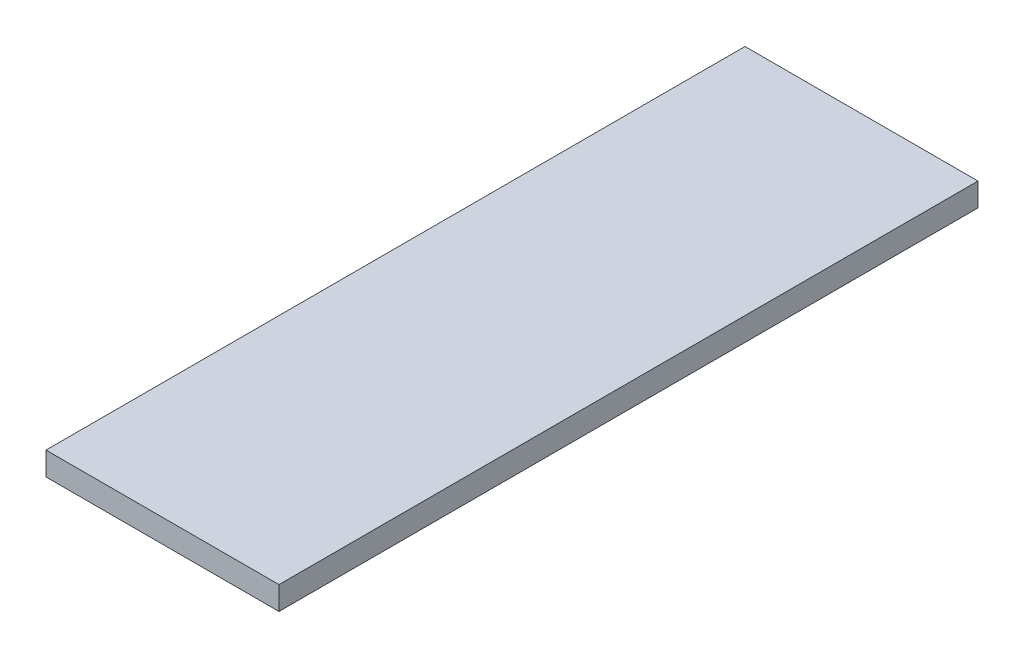
ISO-10303-21;
HEADER;
FILE_DESCRIPTION(('STEP AP214'),'2;1');
FILE_NAME('part.step','',(''),(''),'','','');
FILE_SCHEMA(('AUTOMOTIVE_DESIGN { 1 0 10303 214 1 1 1 1 }'));
ENDSEC;
DATA;
#1=APPLICATION_CONTEXT('core data for automotive mechanical design processes');
#2=APPLICATION_PROTOCOL_DEFINITION('international standard','automotive_design',2000,#1);
#3=PRODUCT_CONTEXT('',#1,'mechanical');
#4=PRODUCT('Part','Part','',(#3));
#5=PRODUCT_RELATED_PRODUCT_CATEGORY('part','',(#4));
#6=PRODUCT_DEFINITION_FORMATION('','',#4);
#7=PRODUCT_DEFINITION_CONTEXT('part definition',#1,'design');
#8=PRODUCT_DEFINITION('design','',#6,#7);
#9=PRODUCT_DEFINITION_SHAPE('','',#8);
#10=(LENGTH_UNIT() NAMED_UNIT(*) SI_UNIT(.MILLI.,.METRE.));
#11=(NAMED_UNIT(*) PLANE_ANGLE_UNIT() SI_UNIT($,.RADIAN.));
#12=(NAMED_UNIT(*) SI_UNIT($,.STERADIAN.) SOLID_ANGLE_UNIT());
#13=UNCERTAINTY_MEASURE_WITH_UNIT(LENGTH_MEASURE(1.E-05),#10,'distance_accuracy_value','');
#14=(GEOMETRIC_REPRESENTATION_CONTEXT(3) GLOBAL_UNCERTAINTY_ASSIGNED_CONTEXT((#13)) GLOBAL_UNIT_ASSIGNED_CONTEXT((#10,
#11,#12)) REPRESENTATION_CONTEXT('',''));
#15=CARTESIAN_POINT('',(0.,0.,0.));
#16=DIRECTION('',(0.,0.,1.));
#17=DIRECTION('',(1.,0.,0.));
#18=AXIS2_PLACEMENT_3D('',#15,#16,#17);
#19=CARTESIAN_POINT('',(0.,10.,0.));
#20=DIRECTION('',(1.,0.,0.));
#21=DIRECTION('',(0.,0.,-1.));
#22=AXIS2_PLACEMENT_3D('',#19,#20,#21);
#23=PLANE('',#22);
#24=DIRECTION('',(0.,0.,1.));
#25=VECTOR('',#24,1.);
#26=CARTESIAN_POINT('',(0.,0.,0.));
#27=LINE('',#26,#25);
#28=CARTESIAN_POINT('',(0.,0.,-300.));
#29=VERTEX_POINT('',#28);
#30=CARTESIAN_POINT('',(0.,0.,0.));
#31=VERTEX_POINT('',#30);
#32=EDGE_CURVE('E98',#29,#31,#27,.T.);
#33=ORIENTED_EDGE('',*,*,#32,.T.);
#34=DIRECTION('',(0.,-1.,0.));
#35=VECTOR('',#34,1.);
#36=CARTESIAN_POINT('',(0.,10.,0.));
#37=LINE('',#36,#35);
#38=CARTESIAN_POINT('',(0.,10.,0.));
#39=VERTEX_POINT('',#38);
#40=EDGE_CURVE('E11',#39,#31,#37,.T.);
#41=ORIENTED_EDGE('',*,*,#40,.F.);
#42=DIRECTION('',(0.,0.,1.));
#43=VECTOR('',#42,1.);
#44=CARTESIAN_POINT('',(0.,10.,0.));
#45=LINE('',#44,#43);
#46=CARTESIAN_POINT('',(0.,10.,-300.));
#47=VERTEX_POINT('',#46);
#48=EDGE_CURVE('E86',#47,#39,#45,.T.);
#49=ORIENTED_EDGE('',*,*,#48,.F.);
#50=DIRECTION('',(0.,-1.,0.));
#51=VECTOR('',#50,1.);
#52=CARTESIAN_POINT('',(0.,10.,-300.));
#53=LINE('',#52,#51);
#54=EDGE_CURVE('E94',#47,#29,#53,.T.);
#55=ORIENTED_EDGE('',*,*,#54,.T.);
#56=EDGE_LOOP('',(#33,#41,#49,#55));
#57=FACE_BOUND('',#56,.T.);
#58=ADVANCED_FACE('F35',(#57),#23,.F.);
#59=CARTESIAN_POINT('',(0.,10.,0.));
#60=DIRECTION('',(0.,0.,-1.));
#61=DIRECTION('',(-1.,0.,0.));
#62=AXIS2_PLACEMENT_3D('',#59,#60,#61);
#63=PLANE('',#62);
#64=DIRECTION('',(1.,0.,0.));
#65=VECTOR('',#64,1.);
#66=CARTESIAN_POINT('',(0.,0.,0.));
#67=LINE('',#66,#65);
#68=CARTESIAN_POINT('',(100.,0.,0.));
#69=VERTEX_POINT('',#68);
#70=EDGE_CURVE('E90',#31,#69,#67,.T.);
#71=ORIENTED_EDGE('',*,*,#70,.T.);
#72=DIRECTION('',(0.,-1.,0.));
#73=VECTOR('',#72,1.);
#74=CARTESIAN_POINT('',(100.,10.,0.));
#75=LINE('',#74,#73);
#76=CARTESIAN_POINT('',(100.,10.,0.));
#77=VERTEX_POINT('',#76);
#78=EDGE_CURVE('E43',#77,#69,#75,.T.);
#79=ORIENTED_EDGE('',*,*,#78,.F.);
#80=DIRECTION('',(1.,0.,0.));
#81=VECTOR('',#80,1.);
#82=CARTESIAN_POINT('',(0.,10.,0.));
#83=LINE('',#82,#81);
#84=EDGE_CURVE('E81',#39,#77,#83,.T.);
#85=ORIENTED_EDGE('',*,*,#84,.F.);
#86=ORIENTED_EDGE('',*,*,#40,.T.);
#87=EDGE_LOOP('',(#71,#79,#85,#86));
#88=FACE_BOUND('',#87,.T.);
#89=ADVANCED_FACE('F89',(#88),#63,.F.);
#90=CARTESIAN_POINT('',(100.,10.,0.));
#91=DIRECTION('',(-1.,0.,0.));
#92=DIRECTION('',(0.,0.,1.));
#93=AXIS2_PLACEMENT_3D('',#90,#91,#92);
#94=PLANE('',#93);
#95=DIRECTION('',(0.,0.,-1.));
#96=VECTOR('',#95,1.);
#97=CARTESIAN_POINT('',(100.,0.,0.));
#98=LINE('',#97,#96);
#99=CARTESIAN_POINT('',(100.,0.,-300.));
#100=VERTEX_POINT('',#99);
#101=EDGE_CURVE('E68',#69,#100,#98,.T.);
#102=ORIENTED_EDGE('',*,*,#101,.T.);
#103=DIRECTION('',(0.,-1.,0.));
#104=VECTOR('',#103,1.);
#105=CARTESIAN_POINT('',(100.,10.,-300.));
#106=LINE('',#105,#104);
#107=CARTESIAN_POINT('',(100.,10.,-300.));
#108=VERTEX_POINT('',#107);
#109=EDGE_CURVE('E91',#108,#100,#106,.T.);
#110=ORIENTED_EDGE('',*,*,#109,.F.);
#111=DIRECTION('',(0.,0.,-1.));
#112=VECTOR('',#111,1.);
#113=CARTESIAN_POINT('',(100.,10.,0.));
#114=LINE('',#113,#112);
#115=EDGE_CURVE('E84',#77,#108,#114,.T.);
#116=ORIENTED_EDGE('',*,*,#115,.F.);
#117=ORIENTED_EDGE('',*,*,#78,.T.);
#118=EDGE_LOOP('',(#102,#110,#116,#117));
#119=FACE_BOUND('',#118,.T.);
#120=ADVANCED_FACE('F92',(#119),#94,.F.);
#121=CARTESIAN_POINT('',(0.,10.,-300.));
#122=DIRECTION('',(0.,0.,1.));
#123=DIRECTION('',(1.,0.,0.));
#124=AXIS2_PLACEMENT_3D('',#121,#122,#123);
#125=PLANE('',#124);
#126=DIRECTION('',(-1.,0.,0.));
#127=VECTOR('',#126,1.);
#128=CARTESIAN_POINT('',(0.,0.,-300.));
#129=LINE('',#128,#127);
#130=EDGE_CURVE('E74',#100,#29,#129,.T.);
#131=ORIENTED_EDGE('',*,*,#130,.T.);
#132=ORIENTED_EDGE('',*,*,#54,.F.);
#133=DIRECTION('',(-1.,0.,0.));
#134=VECTOR('',#133,1.);
#135=CARTESIAN_POINT('',(0.,10.,-300.));
#136=LINE('',#135,#134);
#137=EDGE_CURVE('E51',#108,#47,#136,.T.);
#138=ORIENTED_EDGE('',*,*,#137,.F.);
#139=ORIENTED_EDGE('',*,*,#109,.T.);
#140=EDGE_LOOP('',(#131,#132,#138,#139));
#141=FACE_BOUND('',#140,.T.);
#142=ADVANCED_FACE('F105',(#141),#125,.F.);
#143=CARTESIAN_POINT('',(0.,10.,0.));
#144=DIRECTION('',(0.,-1.,0.));
#145=DIRECTION('',(0.,0.,-1.));
#146=AXIS2_PLACEMENT_3D('',#143,#144,#145);
#147=PLANE('',#146);
#148=ORIENTED_EDGE('',*,*,#48,.T.);
#149=ORIENTED_EDGE('',*,*,#84,.T.);
#150=ORIENTED_EDGE('',*,*,#115,.T.);
#151=ORIENTED_EDGE('',*,*,#137,.T.);
#152=EDGE_LOOP('',(#148,#149,#150,#151));
#153=FACE_BOUND('',#152,.T.);
#154=ADVANCED_FACE('F82',(#153),#147,.F.);
#155=CARTESIAN_POINT('',(0.,0.,0.));
#156=DIRECTION('',(0.,-1.,0.));
#157=DIRECTION('',(0.,0.,-1.));
#158=AXIS2_PLACEMENT_3D('',#155,#156,#157);
#159=PLANE('',#158);
#160=ORIENTED_EDGE('',*,*,#32,.F.);
#161=ORIENTED_EDGE('',*,*,#130,.F.);
#162=ORIENTED_EDGE('',*,*,#101,.F.);
#163=ORIENTED_EDGE('',*,*,#70,.F.);
#164=EDGE_LOOP('',(#160,#161,#162,#163));
#165=FACE_BOUND('',#164,.T.);
#166=ADVANCED_FACE('F108',(#165),#159,.T.);
#167=CLOSED_SHELL('',(#58,#89,#120,#142,#154,#166));
#168=MANIFOLD_SOLID_BREP('B2',#167);
#169=ADVANCED_BREP_SHAPE_REPRESENTATION('',(#18,#168),#14);
#170=SHAPE_DEFINITION_REPRESENTATION(#9,#169);
ENDSEC;
END-ISO-10303-21;
